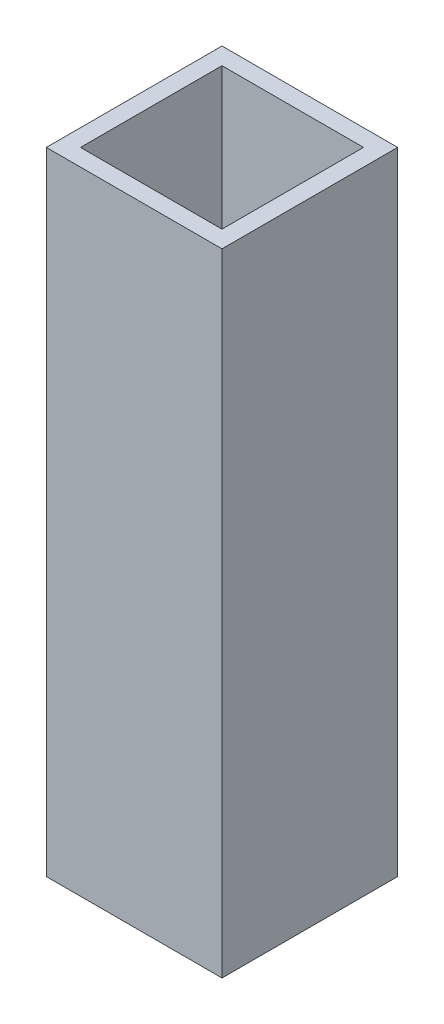
ISO-10303-21;
HEADER;
FILE_DESCRIPTION(('STEP AP214'),'2;1');
FILE_NAME('part.step','',(''),(''),'','','');
FILE_SCHEMA(('AUTOMOTIVE_DESIGN { 1 0 10303 214 1 1 1 1 }'));
ENDSEC;
DATA;
#1=APPLICATION_CONTEXT('core data for automotive mechanical design processes');
#2=APPLICATION_PROTOCOL_DEFINITION('international standard','automotive_design',2000,#1);
#3=PRODUCT_CONTEXT('',#1,'mechanical');
#4=PRODUCT('Part','Part','',(#3));
#5=PRODUCT_RELATED_PRODUCT_CATEGORY('part','',(#4));
#6=PRODUCT_DEFINITION_FORMATION('','',#4);
#7=PRODUCT_DEFINITION_CONTEXT('part definition',#1,'design');
#8=PRODUCT_DEFINITION('design','',#6,#7);
#9=PRODUCT_DEFINITION_SHAPE('','',#8);
#10=(LENGTH_UNIT() NAMED_UNIT(*) SI_UNIT(.MILLI.,.METRE.));
#11=(NAMED_UNIT(*) PLANE_ANGLE_UNIT() SI_UNIT($,.RADIAN.));
#12=(NAMED_UNIT(*) SI_UNIT($,.STERADIAN.) SOLID_ANGLE_UNIT());
#13=UNCERTAINTY_MEASURE_WITH_UNIT(LENGTH_MEASURE(1.E-05),#10,'distance_accuracy_value','');
#14=(GEOMETRIC_REPRESENTATION_CONTEXT(3) GLOBAL_UNCERTAINTY_ASSIGNED_CONTEXT((#13)) GLOBAL_UNIT_ASSIGNED_CONTEXT((#10,
#11,#12)) REPRESENTATION_CONTEXT('',''));
#15=CARTESIAN_POINT('',(0.,0.,0.));
#16=DIRECTION('',(0.,0.,1.));
#17=DIRECTION('',(1.,0.,0.));
#18=AXIS2_PLACEMENT_3D('',#15,#16,#17);
#19=CARTESIAN_POINT('',(0.,44.4,0.));
#20=DIRECTION('',(0.,-1.,0.));
#21=DIRECTION('',(0.,0.,-1.));
#22=AXIS2_PLACEMENT_3D('',#19,#20,#21);
#23=PLANE('',#22);
#24=DIRECTION('',(0.,0.,-1.));
#25=VECTOR('',#24,1.);
#26=CARTESIAN_POINT('',(6.175,44.4,6.175));
#27=LINE('',#26,#25);
#28=CARTESIAN_POINT('',(6.175,44.4,6.175));
#29=VERTEX_POINT('',#28);
#30=CARTESIAN_POINT('',(6.175,44.4,-6.175));
#31=VERTEX_POINT('',#30);
#32=EDGE_CURVE('E163',#29,#31,#27,.T.);
#33=ORIENTED_EDGE('',*,*,#32,.T.);
#34=DIRECTION('',(-1.,0.,0.));
#35=VECTOR('',#34,1.);
#36=CARTESIAN_POINT('',(-6.175,44.4,-6.175));
#37=LINE('',#36,#35);
#38=CARTESIAN_POINT('',(-6.175,44.4,-6.175));
#39=VERTEX_POINT('',#38);
#40=EDGE_CURVE('E98',#31,#39,#37,.T.);
#41=ORIENTED_EDGE('',*,*,#40,.T.);
#42=DIRECTION('',(0.,0.,1.));
#43=VECTOR('',#42,1.);
#44=CARTESIAN_POINT('',(-6.175,44.4,6.175));
#45=LINE('',#44,#43);
#46=CARTESIAN_POINT('',(-6.175,44.4,6.175));
#47=VERTEX_POINT('',#46);
#48=EDGE_CURVE('E168',#39,#47,#45,.T.);
#49=ORIENTED_EDGE('',*,*,#48,.T.);
#50=DIRECTION('',(1.,0.,0.));
#51=VECTOR('',#50,1.);
#52=CARTESIAN_POINT('',(-6.175,44.4,6.175));
#53=LINE('',#52,#51);
#54=EDGE_CURVE('E70',#47,#29,#53,.T.);
#55=ORIENTED_EDGE('',*,*,#54,.T.);
#56=EDGE_LOOP('',(#33,#41,#49,#55));
#57=FACE_BOUND('',#56,.T.);
#58=DIRECTION('',(0.,0.,-1.));
#59=VECTOR('',#58,1.);
#60=CARTESIAN_POINT('',(4.975,44.4,0.));
#61=LINE('',#60,#59);
#62=CARTESIAN_POINT('',(4.975,44.4,4.975));
#63=VERTEX_POINT('',#62);
#64=CARTESIAN_POINT('',(4.975,44.4,-4.975));
#65=VERTEX_POINT('',#64);
#66=EDGE_CURVE('E147',#63,#65,#61,.T.);
#67=ORIENTED_EDGE('',*,*,#66,.F.);
#68=DIRECTION('',(1.,0.,0.));
#69=VECTOR('',#68,1.);
#70=CARTESIAN_POINT('',(0.,44.4,4.975));
#71=LINE('',#70,#69);
#72=CARTESIAN_POINT('',(-4.975,44.4,4.975));
#73=VERTEX_POINT('',#72);
#74=EDGE_CURVE('E160',#73,#63,#71,.T.);
#75=ORIENTED_EDGE('',*,*,#74,.F.);
#76=DIRECTION('',(0.,0.,1.));
#77=VECTOR('',#76,1.);
#78=CARTESIAN_POINT('',(-4.975,44.4,0.));
#79=LINE('',#78,#77);
#80=CARTESIAN_POINT('',(-4.975,44.4,-4.975));
#81=VERTEX_POINT('',#80);
#82=EDGE_CURVE('E157',#81,#73,#79,.T.);
#83=ORIENTED_EDGE('',*,*,#82,.F.);
#84=DIRECTION('',(-1.,0.,0.));
#85=VECTOR('',#84,1.);
#86=CARTESIAN_POINT('',(0.,44.4,-4.975));
#87=LINE('',#86,#85);
#88=EDGE_CURVE('E136',#65,#81,#87,.T.);
#89=ORIENTED_EDGE('',*,*,#88,.F.);
#90=EDGE_LOOP('',(#67,#75,#83,#89));
#91=FACE_BOUND('',#90,.T.);
#92=ADVANCED_FACE('F45',(#57,#91),#23,.F.);
#93=CARTESIAN_POINT('',(6.175,44.4,6.175));
#94=DIRECTION('',(-1.,0.,0.));
#95=DIRECTION('',(0.,0.,1.));
#96=AXIS2_PLACEMENT_3D('',#93,#94,#95);
#97=PLANE('',#96);
#98=DIRECTION('',(0.,0.,-1.));
#99=VECTOR('',#98,1.);
#100=CARTESIAN_POINT('',(6.175,0.,6.175));
#101=LINE('',#100,#99);
#102=CARTESIAN_POINT('',(6.175,0.,6.175));
#103=VERTEX_POINT('',#102);
#104=CARTESIAN_POINT('',(6.175,0.,-6.175));
#105=VERTEX_POINT('',#104);
#106=EDGE_CURVE('E174',#103,#105,#101,.T.);
#107=ORIENTED_EDGE('',*,*,#106,.T.);
#108=DIRECTION('',(0.,-1.,0.));
#109=VECTOR('',#108,1.);
#110=CARTESIAN_POINT('',(6.175,44.4,-6.175));
#111=LINE('',#110,#109);
#112=EDGE_CURVE('E11',#31,#105,#111,.T.);
#113=ORIENTED_EDGE('',*,*,#112,.F.);
#114=ORIENTED_EDGE('',*,*,#32,.F.);
#115=DIRECTION('',(0.,-1.,0.));
#116=VECTOR('',#115,1.);
#117=CARTESIAN_POINT('',(6.175,44.4,6.175));
#118=LINE('',#117,#116);
#119=EDGE_CURVE('E173',#29,#103,#118,.T.);
#120=ORIENTED_EDGE('',*,*,#119,.T.);
#121=EDGE_LOOP('',(#107,#113,#114,#120));
#122=FACE_BOUND('',#121,.T.);
#123=ADVANCED_FACE('F47',(#122),#97,.F.);
#124=CARTESIAN_POINT('',(-6.175,44.4,-6.175));
#125=DIRECTION('',(0.,0.,1.));
#126=DIRECTION('',(1.,0.,0.));
#127=AXIS2_PLACEMENT_3D('',#124,#125,#126);
#128=PLANE('',#127);
#129=DIRECTION('',(-1.,0.,0.));
#130=VECTOR('',#129,1.);
#131=CARTESIAN_POINT('',(-6.175,0.,-6.175));
#132=LINE('',#131,#130);
#133=CARTESIAN_POINT('',(-6.175,0.,-6.175));
#134=VERTEX_POINT('',#133);
#135=EDGE_CURVE('E178',#105,#134,#132,.T.);
#136=ORIENTED_EDGE('',*,*,#135,.T.);
#137=DIRECTION('',(0.,-1.,0.));
#138=VECTOR('',#137,1.);
#139=CARTESIAN_POINT('',(-6.175,44.4,-6.175));
#140=LINE('',#139,#138);
#141=EDGE_CURVE('E54',#39,#134,#140,.T.);
#142=ORIENTED_EDGE('',*,*,#141,.F.);
#143=ORIENTED_EDGE('',*,*,#40,.F.);
#144=ORIENTED_EDGE('',*,*,#112,.T.);
#145=EDGE_LOOP('',(#136,#142,#143,#144));
#146=FACE_BOUND('',#145,.T.);
#147=ADVANCED_FACE('F212',(#146),#128,.F.);
#148=CARTESIAN_POINT('',(-6.175,44.4,6.175));
#149=DIRECTION('',(1.,0.,0.));
#150=DIRECTION('',(0.,0.,-1.));
#151=AXIS2_PLACEMENT_3D('',#148,#149,#150);
#152=PLANE('',#151);
#153=DIRECTION('',(0.,0.,1.));
#154=VECTOR('',#153,1.);
#155=CARTESIAN_POINT('',(-6.175,0.,6.175));
#156=LINE('',#155,#154);
#157=CARTESIAN_POINT('',(-6.175,0.,6.175));
#158=VERTEX_POINT('',#157);
#159=EDGE_CURVE('E181',#134,#158,#156,.T.);
#160=ORIENTED_EDGE('',*,*,#159,.T.);
#161=DIRECTION('',(0.,-1.,0.));
#162=VECTOR('',#161,1.);
#163=CARTESIAN_POINT('',(-6.175,44.4,6.175));
#164=LINE('',#163,#162);
#165=EDGE_CURVE('E188',#47,#158,#164,.T.);
#166=ORIENTED_EDGE('',*,*,#165,.F.);
#167=ORIENTED_EDGE('',*,*,#48,.F.);
#168=ORIENTED_EDGE('',*,*,#141,.T.);
#169=EDGE_LOOP('',(#160,#166,#167,#168));
#170=FACE_BOUND('',#169,.T.);
#171=ADVANCED_FACE('F195',(#170),#152,.F.);
#172=CARTESIAN_POINT('',(-6.175,44.4,6.175));
#173=DIRECTION('',(0.,0.,-1.));
#174=DIRECTION('',(-1.,0.,0.));
#175=AXIS2_PLACEMENT_3D('',#172,#173,#174);
#176=PLANE('',#175);
#177=DIRECTION('',(1.,0.,0.));
#178=VECTOR('',#177,1.);
#179=CARTESIAN_POINT('',(-6.175,0.,6.175));
#180=LINE('',#179,#178);
#181=EDGE_CURVE('E91',#158,#103,#180,.T.);
#182=ORIENTED_EDGE('',*,*,#181,.T.);
#183=ORIENTED_EDGE('',*,*,#119,.F.);
#184=ORIENTED_EDGE('',*,*,#54,.F.);
#185=ORIENTED_EDGE('',*,*,#165,.T.);
#186=EDGE_LOOP('',(#182,#183,#184,#185));
#187=FACE_BOUND('',#186,.T.);
#188=ADVANCED_FACE('F203',(#187),#176,.F.);
#189=CARTESIAN_POINT('',(0.,0.,0.));
#190=DIRECTION('',(0.,-1.,0.));
#191=DIRECTION('',(0.,0.,-1.));
#192=AXIS2_PLACEMENT_3D('',#189,#190,#191);
#193=PLANE('',#192);
#194=ORIENTED_EDGE('',*,*,#106,.F.);
#195=ORIENTED_EDGE('',*,*,#181,.F.);
#196=ORIENTED_EDGE('',*,*,#159,.F.);
#197=ORIENTED_EDGE('',*,*,#135,.F.);
#198=EDGE_LOOP('',(#194,#195,#196,#197));
#199=FACE_BOUND('',#198,.T.);
#200=ADVANCED_FACE('F199',(#199),#193,.T.);
#201=CARTESIAN_POINT('',(4.975,44.4,6.175));
#202=DIRECTION('',(-1.,0.,0.));
#203=DIRECTION('',(0.,0.,1.));
#204=AXIS2_PLACEMENT_3D('',#201,#202,#203);
#205=PLANE('',#204);
#206=DIRECTION('',(0.,0.,-1.));
#207=VECTOR('',#206,1.);
#208=CARTESIAN_POINT('',(4.975,1.2,0.));
#209=LINE('',#208,#207);
#210=CARTESIAN_POINT('',(4.975,1.2,4.975));
#211=VERTEX_POINT('',#210);
#212=CARTESIAN_POINT('',(4.975,1.2,-4.975));
#213=VERTEX_POINT('',#212);
#214=EDGE_CURVE('E126',#211,#213,#209,.T.);
#215=ORIENTED_EDGE('',*,*,#214,.F.);
#216=DIRECTION('',(0.,-1.,0.));
#217=VECTOR('',#216,1.);
#218=CARTESIAN_POINT('',(4.975,44.4,4.975));
#219=LINE('',#218,#217);
#220=EDGE_CURVE('E151',#63,#211,#219,.T.);
#221=ORIENTED_EDGE('',*,*,#220,.F.);
#222=ORIENTED_EDGE('',*,*,#66,.T.);
#223=DIRECTION('',(0.,-1.,0.));
#224=VECTOR('',#223,1.);
#225=CARTESIAN_POINT('',(4.975,44.4,-4.975));
#226=LINE('',#225,#224);
#227=EDGE_CURVE('E140',#65,#213,#226,.T.);
#228=ORIENTED_EDGE('',*,*,#227,.T.);
#229=EDGE_LOOP('',(#215,#221,#222,#228));
#230=FACE_BOUND('',#229,.T.);
#231=ADVANCED_FACE('F210',(#230),#205,.T.);
#232=CARTESIAN_POINT('',(-6.175,44.4,-4.975));
#233=DIRECTION('',(0.,0.,1.));
#234=DIRECTION('',(1.,0.,0.));
#235=AXIS2_PLACEMENT_3D('',#232,#233,#234);
#236=PLANE('',#235);
#237=DIRECTION('',(-1.,0.,0.));
#238=VECTOR('',#237,1.);
#239=CARTESIAN_POINT('',(0.,1.2,-4.975));
#240=LINE('',#239,#238);
#241=CARTESIAN_POINT('',(-4.975,1.2,-4.975));
#242=VERTEX_POINT('',#241);
#243=EDGE_CURVE('E120',#213,#242,#240,.T.);
#244=ORIENTED_EDGE('',*,*,#243,.F.);
#245=ORIENTED_EDGE('',*,*,#227,.F.);
#246=ORIENTED_EDGE('',*,*,#88,.T.);
#247=DIRECTION('',(0.,-1.,0.));
#248=VECTOR('',#247,1.);
#249=CARTESIAN_POINT('',(-4.975,44.4,-4.975));
#250=LINE('',#249,#248);
#251=EDGE_CURVE('E133',#81,#242,#250,.T.);
#252=ORIENTED_EDGE('',*,*,#251,.T.);
#253=EDGE_LOOP('',(#244,#245,#246,#252));
#254=FACE_BOUND('',#253,.T.);
#255=ADVANCED_FACE('F134',(#254),#236,.T.);
#256=CARTESIAN_POINT('',(-4.975,44.4,6.175));
#257=DIRECTION('',(1.,0.,0.));
#258=DIRECTION('',(0.,0.,-1.));
#259=AXIS2_PLACEMENT_3D('',#256,#257,#258);
#260=PLANE('',#259);
#261=DIRECTION('',(0.,0.,1.));
#262=VECTOR('',#261,1.);
#263=CARTESIAN_POINT('',(-4.975,1.2,0.));
#264=LINE('',#263,#262);
#265=CARTESIAN_POINT('',(-4.975,1.2,4.975));
#266=VERTEX_POINT('',#265);
#267=EDGE_CURVE('E124',#242,#266,#264,.T.);
#268=ORIENTED_EDGE('',*,*,#267,.F.);
#269=ORIENTED_EDGE('',*,*,#251,.F.);
#270=ORIENTED_EDGE('',*,*,#82,.T.);
#271=DIRECTION('',(0.,-1.,0.));
#272=VECTOR('',#271,1.);
#273=CARTESIAN_POINT('',(-4.975,44.4,4.975));
#274=LINE('',#273,#272);
#275=EDGE_CURVE('E61',#73,#266,#274,.T.);
#276=ORIENTED_EDGE('',*,*,#275,.T.);
#277=EDGE_LOOP('',(#268,#269,#270,#276));
#278=FACE_BOUND('',#277,.T.);
#279=ADVANCED_FACE('F142',(#278),#260,.T.);
#280=CARTESIAN_POINT('',(-6.175,44.4,4.975));
#281=DIRECTION('',(0.,0.,-1.));
#282=DIRECTION('',(-1.,0.,0.));
#283=AXIS2_PLACEMENT_3D('',#280,#281,#282);
#284=PLANE('',#283);
#285=DIRECTION('',(1.,0.,0.));
#286=VECTOR('',#285,1.);
#287=CARTESIAN_POINT('',(0.,1.2,4.975));
#288=LINE('',#287,#286);
#289=EDGE_CURVE('E144',#266,#211,#288,.T.);
#290=ORIENTED_EDGE('',*,*,#289,.F.);
#291=ORIENTED_EDGE('',*,*,#275,.F.);
#292=ORIENTED_EDGE('',*,*,#74,.T.);
#293=ORIENTED_EDGE('',*,*,#220,.T.);
#294=EDGE_LOOP('',(#290,#291,#292,#293));
#295=FACE_BOUND('',#294,.T.);
#296=ADVANCED_FACE('F224',(#295),#284,.T.);
#297=CARTESIAN_POINT('',(0.,1.2,0.));
#298=DIRECTION('',(0.,-1.,0.));
#299=DIRECTION('',(0.,0.,-1.));
#300=AXIS2_PLACEMENT_3D('',#297,#298,#299);
#301=PLANE('',#300);
#302=ORIENTED_EDGE('',*,*,#214,.T.);
#303=ORIENTED_EDGE('',*,*,#243,.T.);
#304=ORIENTED_EDGE('',*,*,#267,.T.);
#305=ORIENTED_EDGE('',*,*,#289,.T.);
#306=EDGE_LOOP('',(#302,#303,#304,#305));
#307=FACE_BOUND('',#306,.T.);
#308=ADVANCED_FACE('F122',(#307),#301,.F.);
#309=CLOSED_SHELL('',(#92,#123,#147,#171,#188,#200,#231,#255,#279,#296,#308));
#310=MANIFOLD_SOLID_BREP('B2',#309);
#311=ADVANCED_BREP_SHAPE_REPRESENTATION('',(#18,#310),#14);
#312=SHAPE_DEFINITION_REPRESENTATION(#9,#311);
ENDSEC;
END-ISO-10303-21;
